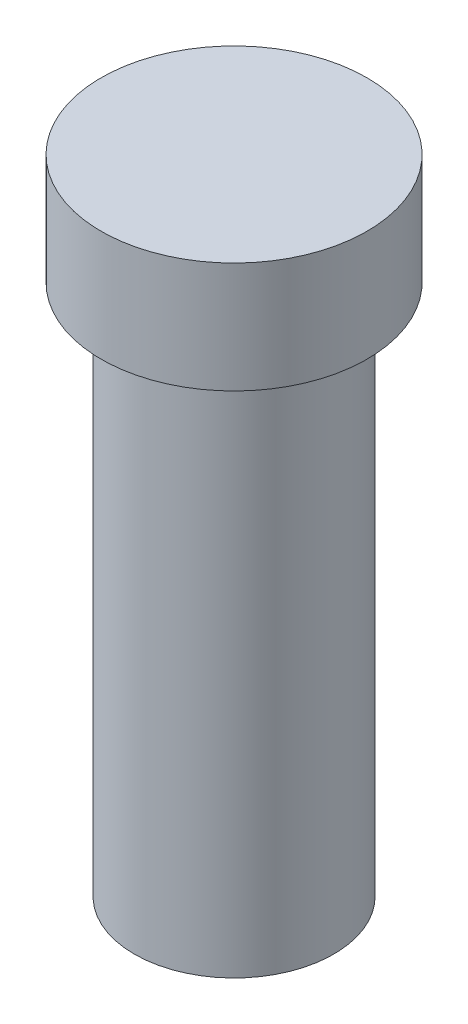
ISO-10303-21;
HEADER;
FILE_DESCRIPTION(('STEP AP214'),'2;1');
FILE_NAME('part.step','',(''),(''),'','','');
FILE_SCHEMA(('AUTOMOTIVE_DESIGN { 1 0 10303 214 1 1 1 1 }'));
ENDSEC;
DATA;
#1=APPLICATION_CONTEXT('core data for automotive mechanical design processes');
#2=APPLICATION_PROTOCOL_DEFINITION('international standard','automotive_design',2000,#1);
#3=PRODUCT_CONTEXT('',#1,'mechanical');
#4=PRODUCT('Part','Part','',(#3));
#5=PRODUCT_RELATED_PRODUCT_CATEGORY('part','',(#4));
#6=PRODUCT_DEFINITION_FORMATION('','',#4);
#7=PRODUCT_DEFINITION_CONTEXT('part definition',#1,'design');
#8=PRODUCT_DEFINITION('design','',#6,#7);
#9=PRODUCT_DEFINITION_SHAPE('','',#8);
#10=(LENGTH_UNIT() NAMED_UNIT(*) SI_UNIT(.MILLI.,.METRE.));
#11=(NAMED_UNIT(*) PLANE_ANGLE_UNIT() SI_UNIT($,.RADIAN.));
#12=(NAMED_UNIT(*) SI_UNIT($,.STERADIAN.) SOLID_ANGLE_UNIT());
#13=UNCERTAINTY_MEASURE_WITH_UNIT(LENGTH_MEASURE(1.E-05),#10,'distance_accuracy_value','');
#14=(GEOMETRIC_REPRESENTATION_CONTEXT(3) GLOBAL_UNCERTAINTY_ASSIGNED_CONTEXT((#13)) GLOBAL_UNIT_ASSIGNED_CONTEXT((#10,
#11,#12)) REPRESENTATION_CONTEXT('',''));
#15=CARTESIAN_POINT('',(0.,0.,0.));
#16=DIRECTION('',(0.,0.,1.));
#17=DIRECTION('',(1.,0.,0.));
#18=AXIS2_PLACEMENT_3D('',#15,#16,#17);
#19=CARTESIAN_POINT('',(57.15,0.,0.));
#20=DIRECTION('',(0.,-1.,0.));
#21=DIRECTION('',(0.,0.,-1.));
#22=AXIS2_PLACEMENT_3D('',#19,#20,#21);
#23=PLANE('',#22);
#24=CARTESIAN_POINT('',(0.,0.,0.));
#25=DIRECTION('',(0.,-1.,0.));
#26=DIRECTION('',(0.,0.,-1.));
#27=AXIS2_PLACEMENT_3D('',#24,#25,#26);
#28=CIRCLE('',#27,57.15);
#29=CARTESIAN_POINT('',(0.,0.,-57.15));
#30=VERTEX_POINT('',#29);
#31=EDGE_CURVE('E54',#30,#30,#28,.T.);
#32=ORIENTED_EDGE('',*,*,#31,.T.);
#33=EDGE_LOOP('',(#32));
#34=FACE_BOUND('',#33,.T.);
#35=ADVANCED_FACE('F37',(#34),#23,.T.);
#36=CARTESIAN_POINT('',(0.,368.3,0.));
#37=DIRECTION('',(0.,1.,0.));
#38=DIRECTION('',(0.,0.,1.));
#39=AXIS2_PLACEMENT_3D('',#36,#37,#38);
#40=PLANE('',#39);
#41=CARTESIAN_POINT('',(0.,368.3,0.));
#42=DIRECTION('',(0.,-1.,0.));
#43=DIRECTION('',(0.,0.,-1.));
#44=AXIS2_PLACEMENT_3D('',#41,#42,#43);
#45=CIRCLE('',#44,76.2);
#46=CARTESIAN_POINT('',(0.,368.3,-76.2));
#47=VERTEX_POINT('',#46);
#48=EDGE_CURVE('E10',#47,#47,#45,.T.);
#49=ORIENTED_EDGE('',*,*,#48,.F.);
#50=EDGE_LOOP('',(#49));
#51=FACE_BOUND('',#50,.T.);
#52=ADVANCED_FACE('F73',(#51),#40,.T.);
#53=CARTESIAN_POINT('',(0.,0.,0.));
#54=DIRECTION('',(0.,-1.,0.));
#55=DIRECTION('',(0.,0.,-1.));
#56=AXIS2_PLACEMENT_3D('',#53,#54,#55);
#57=CYLINDRICAL_SURFACE('',#56,76.2);
#58=ORIENTED_EDGE('',*,*,#48,.T.);
#59=EDGE_LOOP('',(#58));
#60=FACE_BOUND('',#59,.T.);
#61=CARTESIAN_POINT('',(0.,304.8,0.));
#62=DIRECTION('',(0.,-1.,0.));
#63=DIRECTION('',(0.,0.,-1.));
#64=AXIS2_PLACEMENT_3D('',#61,#62,#63);
#65=CIRCLE('',#64,76.2);
#66=CARTESIAN_POINT('',(0.,304.8,-76.2));
#67=VERTEX_POINT('',#66);
#68=EDGE_CURVE('E44',#67,#67,#65,.T.);
#69=ORIENTED_EDGE('',*,*,#68,.F.);
#70=EDGE_LOOP('',(#69));
#71=FACE_BOUND('',#70,.T.);
#72=ADVANCED_FACE('F70',(#60,#71),#57,.T.);
#73=CARTESIAN_POINT('',(76.2,304.8,0.));
#74=DIRECTION('',(0.,-1.,0.));
#75=DIRECTION('',(0.,0.,-1.));
#76=AXIS2_PLACEMENT_3D('',#73,#74,#75);
#77=PLANE('',#76);
#78=ORIENTED_EDGE('',*,*,#68,.T.);
#79=EDGE_LOOP('',(#78));
#80=FACE_BOUND('',#79,.T.);
#81=CARTESIAN_POINT('',(0.,304.8,0.));
#82=DIRECTION('',(0.,-1.,0.));
#83=DIRECTION('',(0.,0.,-1.));
#84=AXIS2_PLACEMENT_3D('',#81,#82,#83);
#85=CIRCLE('',#84,57.15);
#86=CARTESIAN_POINT('',(0.,304.8,-57.15));
#87=VERTEX_POINT('',#86);
#88=EDGE_CURVE('E49',#87,#87,#85,.T.);
#89=ORIENTED_EDGE('',*,*,#88,.F.);
#90=EDGE_LOOP('',(#89));
#91=FACE_BOUND('',#90,.T.);
#92=ADVANCED_FACE('F64',(#80,#91),#77,.T.);
#93=CARTESIAN_POINT('',(0.,0.,0.));
#94=DIRECTION('',(0.,-1.,0.));
#95=DIRECTION('',(0.,0.,-1.));
#96=AXIS2_PLACEMENT_3D('',#93,#94,#95);
#97=CYLINDRICAL_SURFACE('',#96,57.15);
#98=ORIENTED_EDGE('',*,*,#88,.T.);
#99=EDGE_LOOP('',(#98));
#100=FACE_BOUND('',#99,.T.);
#101=ORIENTED_EDGE('',*,*,#31,.F.);
#102=EDGE_LOOP('',(#101));
#103=FACE_BOUND('',#102,.T.);
#104=ADVANCED_FACE('F62',(#100,#103),#97,.T.);
#105=CLOSED_SHELL('',(#35,#52,#72,#92,#104));
#106=MANIFOLD_SOLID_BREP('B2',#105);
#107=ADVANCED_BREP_SHAPE_REPRESENTATION('',(#18,#106),#14);
#108=SHAPE_DEFINITION_REPRESENTATION(#9,#107);
ENDSEC;
END-ISO-10303-21;
